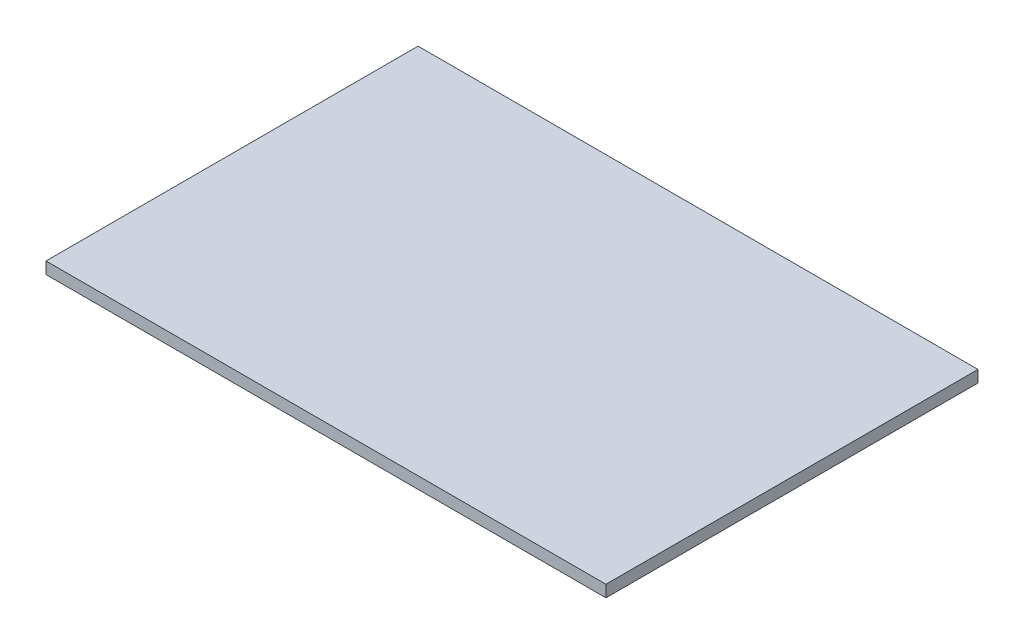
ISO-10303-21;
HEADER;
FILE_DESCRIPTION(('STEP AP214'),'2;1');
FILE_NAME('part.step','',(''),(''),'','','');
FILE_SCHEMA(('AUTOMOTIVE_DESIGN { 1 0 10303 214 1 1 1 1 }'));
ENDSEC;
DATA;
#1=APPLICATION_CONTEXT('core data for automotive mechanical design processes');
#2=APPLICATION_PROTOCOL_DEFINITION('international standard','automotive_design',2000,#1);
#3=PRODUCT_CONTEXT('',#1,'mechanical');
#4=PRODUCT('Part','Part','',(#3));
#5=PRODUCT_RELATED_PRODUCT_CATEGORY('part','',(#4));
#6=PRODUCT_DEFINITION_FORMATION('','',#4);
#7=PRODUCT_DEFINITION_CONTEXT('part definition',#1,'design');
#8=PRODUCT_DEFINITION('design','',#6,#7);
#9=PRODUCT_DEFINITION_SHAPE('','',#8);
#10=(LENGTH_UNIT() NAMED_UNIT(*) SI_UNIT(.MILLI.,.METRE.));
#11=(NAMED_UNIT(*) PLANE_ANGLE_UNIT() SI_UNIT($,.RADIAN.));
#12=(NAMED_UNIT(*) SI_UNIT($,.STERADIAN.) SOLID_ANGLE_UNIT());
#13=UNCERTAINTY_MEASURE_WITH_UNIT(LENGTH_MEASURE(1.E-05),#10,'distance_accuracy_value','');
#14=(GEOMETRIC_REPRESENTATION_CONTEXT(3) GLOBAL_UNCERTAINTY_ASSIGNED_CONTEXT((#13)) GLOBAL_UNIT_ASSIGNED_CONTEXT((#10,
#11,#12)) REPRESENTATION_CONTEXT('',''));
#15=CARTESIAN_POINT('',(0.,0.,0.));
#16=DIRECTION('',(0.,0.,1.));
#17=DIRECTION('',(1.,0.,0.));
#18=AXIS2_PLACEMENT_3D('',#15,#16,#17);
#19=CARTESIAN_POINT('',(38.,1.6,25.25));
#20=DIRECTION('',(-1.,0.,0.));
#21=DIRECTION('',(0.,0.,1.));
#22=AXIS2_PLACEMENT_3D('',#19,#20,#21);
#23=PLANE('',#22);
#24=DIRECTION('',(0.,0.,-1.));
#25=VECTOR('',#24,1.);
#26=CARTESIAN_POINT('',(38.,0.,25.25));
#27=LINE('',#26,#25);
#28=CARTESIAN_POINT('',(38.,0.,25.25));
#29=VERTEX_POINT('',#28);
#30=CARTESIAN_POINT('',(38.,0.,-25.25));
#31=VERTEX_POINT('',#30);
#32=EDGE_CURVE('E95',#29,#31,#27,.T.);
#33=ORIENTED_EDGE('',*,*,#32,.T.);
#34=DIRECTION('',(0.,-1.,0.));
#35=VECTOR('',#34,1.);
#36=CARTESIAN_POINT('',(38.,1.6,-25.25));
#37=LINE('',#36,#35);
#38=CARTESIAN_POINT('',(38.,1.6,-25.25));
#39=VERTEX_POINT('',#38);
#40=EDGE_CURVE('E11',#39,#31,#37,.T.);
#41=ORIENTED_EDGE('',*,*,#40,.F.);
#42=DIRECTION('',(0.,0.,-1.));
#43=VECTOR('',#42,1.);
#44=CARTESIAN_POINT('',(38.,1.6,25.25));
#45=LINE('',#44,#43);
#46=CARTESIAN_POINT('',(38.,1.6,25.25));
#47=VERTEX_POINT('',#46);
#48=EDGE_CURVE('E83',#47,#39,#45,.T.);
#49=ORIENTED_EDGE('',*,*,#48,.F.);
#50=DIRECTION('',(0.,-1.,0.));
#51=VECTOR('',#50,1.);
#52=CARTESIAN_POINT('',(38.,1.6,25.25));
#53=LINE('',#52,#51);
#54=EDGE_CURVE('E91',#47,#29,#53,.T.);
#55=ORIENTED_EDGE('',*,*,#54,.T.);
#56=EDGE_LOOP('',(#33,#41,#49,#55));
#57=FACE_BOUND('',#56,.T.);
#58=ADVANCED_FACE('F32',(#57),#23,.F.);
#59=CARTESIAN_POINT('',(-38.,1.6,-25.25));
#60=DIRECTION('',(0.,0.,1.));
#61=DIRECTION('',(1.,0.,0.));
#62=AXIS2_PLACEMENT_3D('',#59,#60,#61);
#63=PLANE('',#62);
#64=DIRECTION('',(-1.,0.,0.));
#65=VECTOR('',#64,1.);
#66=CARTESIAN_POINT('',(-38.,0.,-25.25));
#67=LINE('',#66,#65);
#68=CARTESIAN_POINT('',(-38.,0.,-25.25));
#69=VERTEX_POINT('',#68);
#70=EDGE_CURVE('E87',#31,#69,#67,.T.);
#71=ORIENTED_EDGE('',*,*,#70,.T.);
#72=DIRECTION('',(0.,-1.,0.));
#73=VECTOR('',#72,1.);
#74=CARTESIAN_POINT('',(-38.,1.6,-25.25));
#75=LINE('',#74,#73);
#76=CARTESIAN_POINT('',(-38.,1.6,-25.25));
#77=VERTEX_POINT('',#76);
#78=EDGE_CURVE('E40',#77,#69,#75,.T.);
#79=ORIENTED_EDGE('',*,*,#78,.F.);
#80=DIRECTION('',(-1.,0.,0.));
#81=VECTOR('',#80,1.);
#82=CARTESIAN_POINT('',(-38.,1.6,-25.25));
#83=LINE('',#82,#81);
#84=EDGE_CURVE('E78',#39,#77,#83,.T.);
#85=ORIENTED_EDGE('',*,*,#84,.F.);
#86=ORIENTED_EDGE('',*,*,#40,.T.);
#87=EDGE_LOOP('',(#71,#79,#85,#86));
#88=FACE_BOUND('',#87,.T.);
#89=ADVANCED_FACE('F86',(#88),#63,.F.);
#90=CARTESIAN_POINT('',(-38.,1.6,25.25));
#91=DIRECTION('',(1.,0.,0.));
#92=DIRECTION('',(0.,0.,-1.));
#93=AXIS2_PLACEMENT_3D('',#90,#91,#92);
#94=PLANE('',#93);
#95=DIRECTION('',(0.,0.,1.));
#96=VECTOR('',#95,1.);
#97=CARTESIAN_POINT('',(-38.,0.,25.25));
#98=LINE('',#97,#96);
#99=CARTESIAN_POINT('',(-38.,0.,25.25));
#100=VERTEX_POINT('',#99);
#101=EDGE_CURVE('E65',#69,#100,#98,.T.);
#102=ORIENTED_EDGE('',*,*,#101,.T.);
#103=DIRECTION('',(0.,-1.,0.));
#104=VECTOR('',#103,1.);
#105=CARTESIAN_POINT('',(-38.,1.6,25.25));
#106=LINE('',#105,#104);
#107=CARTESIAN_POINT('',(-38.,1.6,25.25));
#108=VERTEX_POINT('',#107);
#109=EDGE_CURVE('E88',#108,#100,#106,.T.);
#110=ORIENTED_EDGE('',*,*,#109,.F.);
#111=DIRECTION('',(0.,0.,1.));
#112=VECTOR('',#111,1.);
#113=CARTESIAN_POINT('',(-38.,1.6,25.25));
#114=LINE('',#113,#112);
#115=EDGE_CURVE('E81',#77,#108,#114,.T.);
#116=ORIENTED_EDGE('',*,*,#115,.F.);
#117=ORIENTED_EDGE('',*,*,#78,.T.);
#118=EDGE_LOOP('',(#102,#110,#116,#117));
#119=FACE_BOUND('',#118,.T.);
#120=ADVANCED_FACE('F89',(#119),#94,.F.);
#121=CARTESIAN_POINT('',(-38.,1.6,25.25));
#122=DIRECTION('',(0.,0.,-1.));
#123=DIRECTION('',(-1.,0.,0.));
#124=AXIS2_PLACEMENT_3D('',#121,#122,#123);
#125=PLANE('',#124);
#126=DIRECTION('',(1.,0.,0.));
#127=VECTOR('',#126,1.);
#128=CARTESIAN_POINT('',(-38.,0.,25.25));
#129=LINE('',#128,#127);
#130=EDGE_CURVE('E71',#100,#29,#129,.T.);
#131=ORIENTED_EDGE('',*,*,#130,.T.);
#132=ORIENTED_EDGE('',*,*,#54,.F.);
#133=DIRECTION('',(1.,0.,0.));
#134=VECTOR('',#133,1.);
#135=CARTESIAN_POINT('',(-38.,1.6,25.25));
#136=LINE('',#135,#134);
#137=EDGE_CURVE('E48',#108,#47,#136,.T.);
#138=ORIENTED_EDGE('',*,*,#137,.F.);
#139=ORIENTED_EDGE('',*,*,#109,.T.);
#140=EDGE_LOOP('',(#131,#132,#138,#139));
#141=FACE_BOUND('',#140,.T.);
#142=ADVANCED_FACE('F102',(#141),#125,.F.);
#143=CARTESIAN_POINT('',(0.,1.6,0.));
#144=DIRECTION('',(0.,-1.,0.));
#145=DIRECTION('',(0.,0.,-1.));
#146=AXIS2_PLACEMENT_3D('',#143,#144,#145);
#147=PLANE('',#146);
#148=ORIENTED_EDGE('',*,*,#48,.T.);
#149=ORIENTED_EDGE('',*,*,#84,.T.);
#150=ORIENTED_EDGE('',*,*,#115,.T.);
#151=ORIENTED_EDGE('',*,*,#137,.T.);
#152=EDGE_LOOP('',(#148,#149,#150,#151));
#153=FACE_BOUND('',#152,.T.);
#154=ADVANCED_FACE('F79',(#153),#147,.F.);
#155=CARTESIAN_POINT('',(0.,0.,0.));
#156=DIRECTION('',(0.,-1.,0.));
#157=DIRECTION('',(0.,0.,-1.));
#158=AXIS2_PLACEMENT_3D('',#155,#156,#157);
#159=PLANE('',#158);
#160=ORIENTED_EDGE('',*,*,#32,.F.);
#161=ORIENTED_EDGE('',*,*,#130,.F.);
#162=ORIENTED_EDGE('',*,*,#101,.F.);
#163=ORIENTED_EDGE('',*,*,#70,.F.);
#164=EDGE_LOOP('',(#160,#161,#162,#163));
#165=FACE_BOUND('',#164,.T.);
#166=ADVANCED_FACE('F105',(#165),#159,.T.);
#167=CLOSED_SHELL('',(#58,#89,#120,#142,#154,#166));
#168=MANIFOLD_SOLID_BREP('B2',#167);
#169=ADVANCED_BREP_SHAPE_REPRESENTATION('',(#18,#168),#14);
#170=SHAPE_DEFINITION_REPRESENTATION(#9,#169);
ENDSEC;
END-ISO-10303-21;
